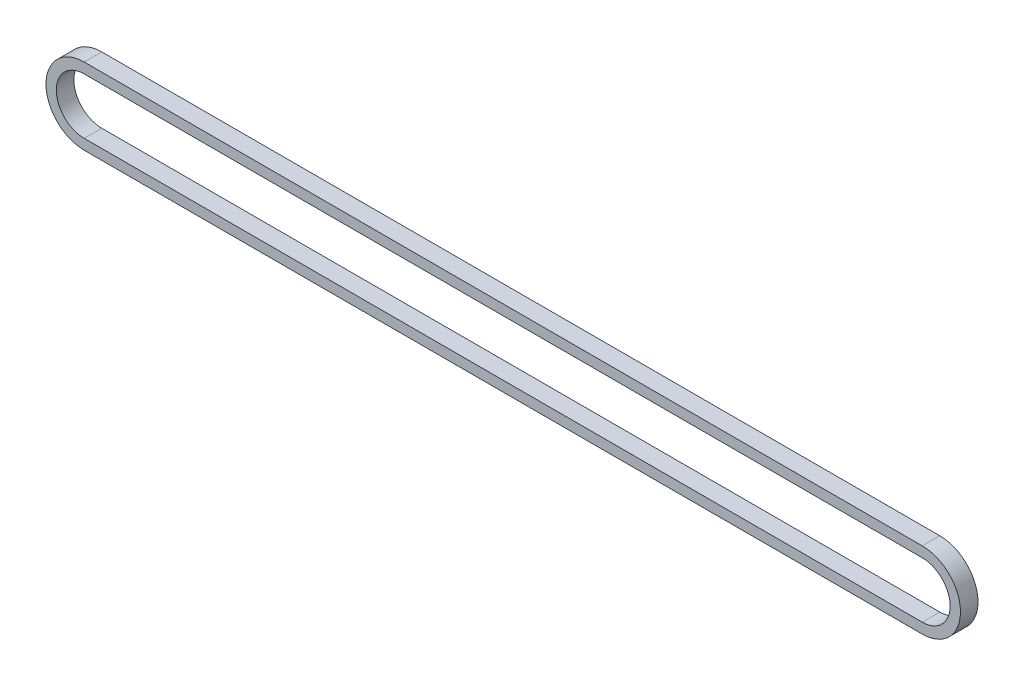
ISO-10303-21;
HEADER;
FILE_DESCRIPTION(('STEP AP214'),'2;1');
FILE_NAME('part.step','',(''),(''),'','','');
FILE_SCHEMA(('AUTOMOTIVE_DESIGN { 1 0 10303 214 1 1 1 1 }'));
ENDSEC;
DATA;
#1=APPLICATION_CONTEXT('core data for automotive mechanical design processes');
#2=APPLICATION_PROTOCOL_DEFINITION('international standard','automotive_design',2000,#1);
#3=PRODUCT_CONTEXT('',#1,'mechanical');
#4=PRODUCT('Part','Part','',(#3));
#5=PRODUCT_RELATED_PRODUCT_CATEGORY('part','',(#4));
#6=PRODUCT_DEFINITION_FORMATION('','',#4);
#7=PRODUCT_DEFINITION_CONTEXT('part definition',#1,'design');
#8=PRODUCT_DEFINITION('design','',#6,#7);
#9=PRODUCT_DEFINITION_SHAPE('','',#8);
#10=(LENGTH_UNIT() NAMED_UNIT(*) SI_UNIT(.MILLI.,.METRE.));
#11=(NAMED_UNIT(*) PLANE_ANGLE_UNIT() SI_UNIT($,.RADIAN.));
#12=(NAMED_UNIT(*) SI_UNIT($,.STERADIAN.) SOLID_ANGLE_UNIT());
#13=UNCERTAINTY_MEASURE_WITH_UNIT(LENGTH_MEASURE(1.E-05),#10,'distance_accuracy_value','');
#14=(GEOMETRIC_REPRESENTATION_CONTEXT(3) GLOBAL_UNCERTAINTY_ASSIGNED_CONTEXT((#13)) GLOBAL_UNIT_ASSIGNED_CONTEXT((#10,
#11,#12)) REPRESENTATION_CONTEXT('',''));
#15=CARTESIAN_POINT('',(0.,0.,0.));
#16=DIRECTION('',(0.,0.,1.));
#17=DIRECTION('',(1.,0.,0.));
#18=AXIS2_PLACEMENT_3D('',#15,#16,#17);
#19=CARTESIAN_POINT('',(-203.2,0.,4.25));
#20=DIRECTION('',(0.,0.,1.));
#21=DIRECTION('',(1.,0.,0.));
#22=AXIS2_PLACEMENT_3D('',#19,#20,#21);
#23=PLANE('',#22);
#24=CARTESIAN_POINT('',(-203.2,0.,4.25));
#25=DIRECTION('',(0.,0.,1.));
#26=DIRECTION('',(1.,0.,0.));
#27=AXIS2_PLACEMENT_3D('',#24,#25,#26);
#28=CIRCLE('',#27,18.52803);
#29=CARTESIAN_POINT('',(-203.2,18.52803,4.25));
#30=VERTEX_POINT('',#29);
#31=CARTESIAN_POINT('',(-203.2,-18.52803,4.25));
#32=VERTEX_POINT('',#31);
#33=EDGE_CURVE('E134',#30,#32,#28,.T.);
#34=ORIENTED_EDGE('',*,*,#33,.T.);
#35=DIRECTION('',(1.,0.,0.));
#36=VECTOR('',#35,1.);
#37=CARTESIAN_POINT('',(-203.2,-18.52803,4.25));
#38=LINE('',#37,#36);
#39=CARTESIAN_POINT('',(203.2,-18.52803,4.25));
#40=VERTEX_POINT('',#39);
#41=EDGE_CURVE('E137',#32,#40,#38,.T.);
#42=ORIENTED_EDGE('',*,*,#41,.T.);
#43=CARTESIAN_POINT('',(203.2,0.,4.25));
#44=DIRECTION('',(0.,0.,1.));
#45=DIRECTION('',(1.,0.,0.));
#46=AXIS2_PLACEMENT_3D('',#43,#44,#45);
#47=CIRCLE('',#46,18.52803);
#48=CARTESIAN_POINT('',(203.2,18.52803,4.25));
#49=VERTEX_POINT('',#48);
#50=EDGE_CURVE('E140',#40,#49,#47,.T.);
#51=ORIENTED_EDGE('',*,*,#50,.T.);
#52=DIRECTION('',(-1.,0.,0.));
#53=VECTOR('',#52,1.);
#54=CARTESIAN_POINT('',(-203.2,18.52803,4.25));
#55=LINE('',#54,#53);
#56=EDGE_CURVE('E142',#49,#30,#55,.T.);
#57=ORIENTED_EDGE('',*,*,#56,.T.);
#58=EDGE_LOOP('',(#34,#42,#51,#57));
#59=FACE_BOUND('',#58,.T.);
#60=DIRECTION('',(1.,0.,0.));
#61=VECTOR('',#60,1.);
#62=CARTESIAN_POINT('',(-203.2,-13.52423,4.25));
#63=LINE('',#62,#61);
#64=CARTESIAN_POINT('',(-203.2,-13.52423,4.25));
#65=VERTEX_POINT('',#64);
#66=CARTESIAN_POINT('',(203.2,-13.52423,4.25));
#67=VERTEX_POINT('',#66);
#68=EDGE_CURVE('E106',#65,#67,#63,.T.);
#69=ORIENTED_EDGE('',*,*,#68,.F.);
#70=CARTESIAN_POINT('',(-203.2,0.,4.25));
#71=DIRECTION('',(0.,0.,1.));
#72=DIRECTION('',(1.,0.,0.));
#73=AXIS2_PLACEMENT_3D('',#70,#71,#72);
#74=CIRCLE('',#73,13.52423);
#75=CARTESIAN_POINT('',(-203.2,13.52423,4.25));
#76=VERTEX_POINT('',#75);
#77=EDGE_CURVE('E98',#76,#65,#74,.T.);
#78=ORIENTED_EDGE('',*,*,#77,.F.);
#79=DIRECTION('',(-1.,0.,0.));
#80=VECTOR('',#79,1.);
#81=CARTESIAN_POINT('',(-203.2,13.52423,4.25));
#82=LINE('',#81,#80);
#83=CARTESIAN_POINT('',(203.2,13.52423,4.25));
#84=VERTEX_POINT('',#83);
#85=EDGE_CURVE('E120',#84,#76,#82,.T.);
#86=ORIENTED_EDGE('',*,*,#85,.F.);
#87=CARTESIAN_POINT('',(203.2,0.,4.25));
#88=DIRECTION('',(0.,0.,1.));
#89=DIRECTION('',(1.,0.,0.));
#90=AXIS2_PLACEMENT_3D('',#87,#88,#89);
#91=CIRCLE('',#90,13.52423);
#92=EDGE_CURVE('E118',#67,#84,#91,.T.);
#93=ORIENTED_EDGE('',*,*,#92,.F.);
#94=EDGE_LOOP('',(#69,#78,#86,#93));
#95=FACE_BOUND('',#94,.T.);
#96=ADVANCED_FACE('F33',(#59,#95),#23,.T.);
#97=CARTESIAN_POINT('',(-203.2,0.,-4.25));
#98=DIRECTION('',(0.,0.,1.));
#99=DIRECTION('',(1.,0.,0.));
#100=AXIS2_PLACEMENT_3D('',#97,#98,#99);
#101=PLANE('',#100);
#102=CARTESIAN_POINT('',(-203.2,0.,-4.25));
#103=DIRECTION('',(0.,0.,1.));
#104=DIRECTION('',(1.,0.,0.));
#105=AXIS2_PLACEMENT_3D('',#102,#103,#104);
#106=CIRCLE('',#105,18.52803);
#107=CARTESIAN_POINT('',(-203.2,18.52803,-4.25));
#108=VERTEX_POINT('',#107);
#109=CARTESIAN_POINT('',(-203.2,-18.52803,-4.25));
#110=VERTEX_POINT('',#109);
#111=EDGE_CURVE('E114',#108,#110,#106,.T.);
#112=ORIENTED_EDGE('',*,*,#111,.F.);
#113=DIRECTION('',(-1.,0.,0.));
#114=VECTOR('',#113,1.);
#115=CARTESIAN_POINT('',(-203.2,18.52803,-4.25));
#116=LINE('',#115,#114);
#117=CARTESIAN_POINT('',(203.2,18.52803,-4.25));
#118=VERTEX_POINT('',#117);
#119=EDGE_CURVE('E138',#118,#108,#116,.T.);
#120=ORIENTED_EDGE('',*,*,#119,.F.);
#121=CARTESIAN_POINT('',(203.2,0.,-4.25));
#122=DIRECTION('',(0.,0.,1.));
#123=DIRECTION('',(1.,0.,0.));
#124=AXIS2_PLACEMENT_3D('',#121,#122,#123);
#125=CIRCLE('',#124,18.52803);
#126=CARTESIAN_POINT('',(203.2,-18.52803,-4.25));
#127=VERTEX_POINT('',#126);
#128=EDGE_CURVE('E149',#127,#118,#125,.T.);
#129=ORIENTED_EDGE('',*,*,#128,.F.);
#130=DIRECTION('',(1.,0.,0.));
#131=VECTOR('',#130,1.);
#132=CARTESIAN_POINT('',(-203.2,-18.52803,-4.25));
#133=LINE('',#132,#131);
#134=EDGE_CURVE('E147',#110,#127,#133,.T.);
#135=ORIENTED_EDGE('',*,*,#134,.F.);
#136=EDGE_LOOP('',(#112,#120,#129,#135));
#137=FACE_BOUND('',#136,.T.);
#138=CARTESIAN_POINT('',(-203.2,0.,-4.25));
#139=DIRECTION('',(0.,0.,1.));
#140=DIRECTION('',(1.,0.,0.));
#141=AXIS2_PLACEMENT_3D('',#138,#139,#140);
#142=CIRCLE('',#141,13.52423);
#143=CARTESIAN_POINT('',(-203.2,13.52423,-4.25));
#144=VERTEX_POINT('',#143);
#145=CARTESIAN_POINT('',(-203.2,-13.52423,-4.25));
#146=VERTEX_POINT('',#145);
#147=EDGE_CURVE('E56',#144,#146,#142,.T.);
#148=ORIENTED_EDGE('',*,*,#147,.T.);
#149=DIRECTION('',(1.,0.,0.));
#150=VECTOR('',#149,1.);
#151=CARTESIAN_POINT('',(-203.2,-13.52423,-4.25));
#152=LINE('',#151,#150);
#153=CARTESIAN_POINT('',(203.2,-13.52423,-4.25));
#154=VERTEX_POINT('',#153);
#155=EDGE_CURVE('E113',#146,#154,#152,.T.);
#156=ORIENTED_EDGE('',*,*,#155,.T.);
#157=CARTESIAN_POINT('',(203.2,0.,-4.25));
#158=DIRECTION('',(0.,0.,1.));
#159=DIRECTION('',(1.,0.,0.));
#160=AXIS2_PLACEMENT_3D('',#157,#158,#159);
#161=CIRCLE('',#160,13.52423);
#162=CARTESIAN_POINT('',(203.2,13.52423,-4.25));
#163=VERTEX_POINT('',#162);
#164=EDGE_CURVE('E126',#154,#163,#161,.T.);
#165=ORIENTED_EDGE('',*,*,#164,.T.);
#166=DIRECTION('',(-1.,0.,0.));
#167=VECTOR('',#166,1.);
#168=CARTESIAN_POINT('',(-203.2,13.52423,-4.25));
#169=LINE('',#168,#167);
#170=EDGE_CURVE('E107',#163,#144,#169,.T.);
#171=ORIENTED_EDGE('',*,*,#170,.T.);
#172=EDGE_LOOP('',(#148,#156,#165,#171));
#173=FACE_BOUND('',#172,.T.);
#174=ADVANCED_FACE('F167',(#137,#173),#101,.F.);
#175=CARTESIAN_POINT('',(-203.2,0.,4.25));
#176=DIRECTION('',(0.,0.,-1.));
#177=DIRECTION('',(-1.,0.,0.));
#178=AXIS2_PLACEMENT_3D('',#175,#176,#177);
#179=CYLINDRICAL_SURFACE('',#178,18.52803);
#180=ORIENTED_EDGE('',*,*,#111,.T.);
#181=DIRECTION('',(0.,0.,-1.));
#182=VECTOR('',#181,1.);
#183=CARTESIAN_POINT('',(-203.2,-18.52803,4.25));
#184=LINE('',#183,#182);
#185=EDGE_CURVE('E11',#32,#110,#184,.T.);
#186=ORIENTED_EDGE('',*,*,#185,.F.);
#187=ORIENTED_EDGE('',*,*,#33,.F.);
#188=DIRECTION('',(0.,0.,-1.));
#189=VECTOR('',#188,1.);
#190=CARTESIAN_POINT('',(-203.2,18.52803,4.25));
#191=LINE('',#190,#189);
#192=EDGE_CURVE('E144',#30,#108,#191,.T.);
#193=ORIENTED_EDGE('',*,*,#192,.T.);
#194=EDGE_LOOP('',(#180,#186,#187,#193));
#195=FACE_BOUND('',#194,.T.);
#196=ADVANCED_FACE('F35',(#195),#179,.T.);
#197=CARTESIAN_POINT('',(-203.2,-18.52803,4.25));
#198=DIRECTION('',(0.,1.,0.));
#199=DIRECTION('',(0.,0.,1.));
#200=AXIS2_PLACEMENT_3D('',#197,#198,#199);
#201=PLANE('',#200);
#202=ORIENTED_EDGE('',*,*,#134,.T.);
#203=DIRECTION('',(0.,0.,-1.));
#204=VECTOR('',#203,1.);
#205=CARTESIAN_POINT('',(203.2,-18.52803,4.25));
#206=LINE('',#205,#204);
#207=EDGE_CURVE('E41',#40,#127,#206,.T.);
#208=ORIENTED_EDGE('',*,*,#207,.F.);
#209=ORIENTED_EDGE('',*,*,#41,.F.);
#210=ORIENTED_EDGE('',*,*,#185,.T.);
#211=EDGE_LOOP('',(#202,#208,#209,#210));
#212=FACE_BOUND('',#211,.T.);
#213=ADVANCED_FACE('F177',(#212),#201,.F.);
#214=CARTESIAN_POINT('',(203.2,0.,4.25));
#215=DIRECTION('',(0.,0.,-1.));
#216=DIRECTION('',(-1.,0.,0.));
#217=AXIS2_PLACEMENT_3D('',#214,#215,#216);
#218=CYLINDRICAL_SURFACE('',#217,18.52803);
#219=ORIENTED_EDGE('',*,*,#128,.T.);
#220=DIRECTION('',(0.,0.,-1.));
#221=VECTOR('',#220,1.);
#222=CARTESIAN_POINT('',(203.2,18.52803,4.25));
#223=LINE('',#222,#221);
#224=EDGE_CURVE('E154',#49,#118,#223,.T.);
#225=ORIENTED_EDGE('',*,*,#224,.F.);
#226=ORIENTED_EDGE('',*,*,#50,.F.);
#227=ORIENTED_EDGE('',*,*,#207,.T.);
#228=EDGE_LOOP('',(#219,#225,#226,#227));
#229=FACE_BOUND('',#228,.T.);
#230=ADVANCED_FACE('F161',(#229),#218,.T.);
#231=CARTESIAN_POINT('',(-203.2,18.52803,4.25));
#232=DIRECTION('',(0.,-1.,0.));
#233=DIRECTION('',(0.,0.,-1.));
#234=AXIS2_PLACEMENT_3D('',#231,#232,#233);
#235=PLANE('',#234);
#236=ORIENTED_EDGE('',*,*,#119,.T.);
#237=ORIENTED_EDGE('',*,*,#192,.F.);
#238=ORIENTED_EDGE('',*,*,#56,.F.);
#239=ORIENTED_EDGE('',*,*,#224,.T.);
#240=EDGE_LOOP('',(#236,#237,#238,#239));
#241=FACE_BOUND('',#240,.T.);
#242=ADVANCED_FACE('F171',(#241),#235,.F.);
#243=CARTESIAN_POINT('',(-203.2,0.,4.25));
#244=DIRECTION('',(0.,0.,-1.));
#245=DIRECTION('',(-1.,0.,0.));
#246=AXIS2_PLACEMENT_3D('',#243,#244,#245);
#247=CYLINDRICAL_SURFACE('',#246,13.52423);
#248=ORIENTED_EDGE('',*,*,#147,.F.);
#249=DIRECTION('',(0.,0.,-1.));
#250=VECTOR('',#249,1.);
#251=CARTESIAN_POINT('',(-203.2,13.52423,4.25));
#252=LINE('',#251,#250);
#253=EDGE_CURVE('E102',#76,#144,#252,.T.);
#254=ORIENTED_EDGE('',*,*,#253,.F.);
#255=ORIENTED_EDGE('',*,*,#77,.T.);
#256=DIRECTION('',(0.,0.,-1.));
#257=VECTOR('',#256,1.);
#258=CARTESIAN_POINT('',(-203.2,-13.52423,4.25));
#259=LINE('',#258,#257);
#260=EDGE_CURVE('E101',#65,#146,#259,.T.);
#261=ORIENTED_EDGE('',*,*,#260,.T.);
#262=EDGE_LOOP('',(#248,#254,#255,#261));
#263=FACE_BOUND('',#262,.T.);
#264=ADVANCED_FACE('F100',(#263),#247,.F.);
#265=CARTESIAN_POINT('',(-203.2,-13.52423,4.25));
#266=DIRECTION('',(0.,1.,0.));
#267=DIRECTION('',(-1.,0.,0.));
#268=AXIS2_PLACEMENT_3D('',#265,#266,#267);
#269=PLANE('',#268);
#270=ORIENTED_EDGE('',*,*,#155,.F.);
#271=ORIENTED_EDGE('',*,*,#260,.F.);
#272=ORIENTED_EDGE('',*,*,#68,.T.);
#273=DIRECTION('',(0.,0.,-1.));
#274=VECTOR('',#273,1.);
#275=CARTESIAN_POINT('',(203.2,-13.52423,4.25));
#276=LINE('',#275,#274);
#277=EDGE_CURVE('E115',#67,#154,#276,.T.);
#278=ORIENTED_EDGE('',*,*,#277,.T.);
#279=EDGE_LOOP('',(#270,#271,#272,#278));
#280=FACE_BOUND('',#279,.T.);
#281=ADVANCED_FACE('F110',(#280),#269,.T.);
#282=CARTESIAN_POINT('',(203.2,0.,4.25));
#283=DIRECTION('',(0.,0.,-1.));
#284=DIRECTION('',(-1.,0.,0.));
#285=AXIS2_PLACEMENT_3D('',#282,#283,#284);
#286=CYLINDRICAL_SURFACE('',#285,13.52423);
#287=ORIENTED_EDGE('',*,*,#164,.F.);
#288=ORIENTED_EDGE('',*,*,#277,.F.);
#289=ORIENTED_EDGE('',*,*,#92,.T.);
#290=DIRECTION('',(0.,0.,-1.));
#291=VECTOR('',#290,1.);
#292=CARTESIAN_POINT('',(203.2,13.52423,4.25));
#293=LINE('',#292,#291);
#294=EDGE_CURVE('E48',#84,#163,#293,.T.);
#295=ORIENTED_EDGE('',*,*,#294,.T.);
#296=EDGE_LOOP('',(#287,#288,#289,#295));
#297=FACE_BOUND('',#296,.T.);
#298=ADVANCED_FACE('F200',(#297),#286,.F.);
#299=CARTESIAN_POINT('',(-203.2,13.52423,4.25));
#300=DIRECTION('',(0.,-1.,0.));
#301=DIRECTION('',(0.,0.,-1.));
#302=AXIS2_PLACEMENT_3D('',#299,#300,#301);
#303=PLANE('',#302);
#304=ORIENTED_EDGE('',*,*,#170,.F.);
#305=ORIENTED_EDGE('',*,*,#294,.F.);
#306=ORIENTED_EDGE('',*,*,#85,.T.);
#307=ORIENTED_EDGE('',*,*,#253,.T.);
#308=EDGE_LOOP('',(#304,#305,#306,#307));
#309=FACE_BOUND('',#308,.T.);
#310=ADVANCED_FACE('F204',(#309),#303,.T.);
#311=CLOSED_SHELL('',(#96,#174,#196,#213,#230,#242,#264,#281,#298,#310));
#312=MANIFOLD_SOLID_BREP('B2',#311);
#313=ADVANCED_BREP_SHAPE_REPRESENTATION('',(#18,#312),#14);
#314=SHAPE_DEFINITION_REPRESENTATION(#9,#313);
ENDSEC;
END-ISO-10303-21;
